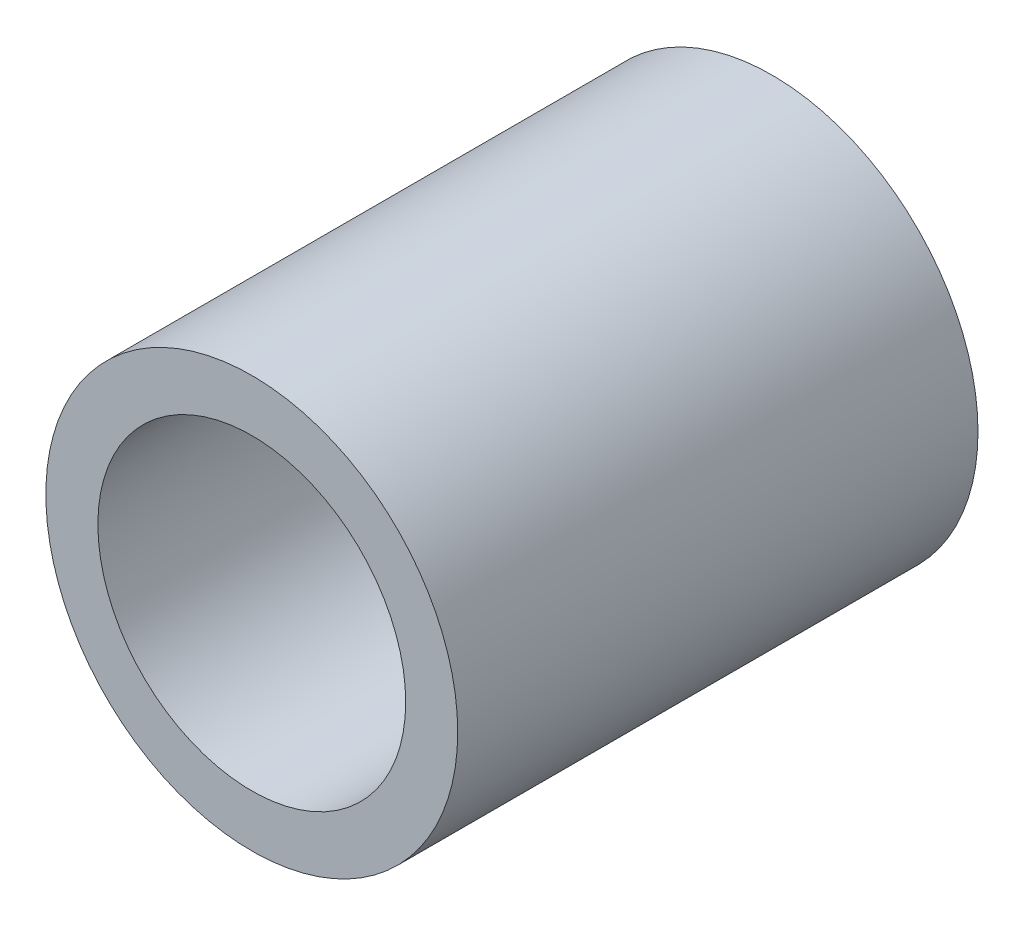
ISO-10303-21;
HEADER;
FILE_DESCRIPTION(('STEP AP214'),'2;1');
FILE_NAME('part.step','',(''),(''),'','','');
FILE_SCHEMA(('AUTOMOTIVE_DESIGN { 1 0 10303 214 1 1 1 1 }'));
ENDSEC;
DATA;
#1=APPLICATION_CONTEXT('core data for automotive mechanical design processes');
#2=APPLICATION_PROTOCOL_DEFINITION('international standard','automotive_design',2000,#1);
#3=PRODUCT_CONTEXT('',#1,'mechanical');
#4=PRODUCT('Part','Part','',(#3));
#5=PRODUCT_RELATED_PRODUCT_CATEGORY('part','',(#4));
#6=PRODUCT_DEFINITION_FORMATION('','',#4);
#7=PRODUCT_DEFINITION_CONTEXT('part definition',#1,'design');
#8=PRODUCT_DEFINITION('design','',#6,#7);
#9=PRODUCT_DEFINITION_SHAPE('','',#8);
#10=(LENGTH_UNIT() NAMED_UNIT(*) SI_UNIT(.MILLI.,.METRE.));
#11=(NAMED_UNIT(*) PLANE_ANGLE_UNIT() SI_UNIT($,.RADIAN.));
#12=(NAMED_UNIT(*) SI_UNIT($,.STERADIAN.) SOLID_ANGLE_UNIT());
#13=UNCERTAINTY_MEASURE_WITH_UNIT(LENGTH_MEASURE(1.E-05),#10,'distance_accuracy_value','');
#14=(GEOMETRIC_REPRESENTATION_CONTEXT(3) GLOBAL_UNCERTAINTY_ASSIGNED_CONTEXT((#13)) GLOBAL_UNIT_ASSIGNED_CONTEXT((#10,
#11,#12)) REPRESENTATION_CONTEXT('',''));
#15=CARTESIAN_POINT('',(0.,0.,0.));
#16=DIRECTION('',(0.,0.,1.));
#17=DIRECTION('',(1.,0.,0.));
#18=AXIS2_PLACEMENT_3D('',#15,#16,#17);
#19=CARTESIAN_POINT('',(0.,0.,-13.716));
#20=DIRECTION('',(0.,0.,1.));
#21=DIRECTION('',(1.,0.,0.));
#22=AXIS2_PLACEMENT_3D('',#19,#20,#21);
#23=CYLINDRICAL_SURFACE('',#22,8.1153);
#24=CARTESIAN_POINT('',(0.,0.,13.716));
#25=DIRECTION('',(0.,0.,1.));
#26=DIRECTION('',(1.,0.,0.));
#27=AXIS2_PLACEMENT_3D('',#24,#25,#26);
#28=CIRCLE('',#27,8.1153);
#29=CARTESIAN_POINT('',(8.1153,0.,13.716));
#30=VERTEX_POINT('',#29);
#31=EDGE_CURVE('E17',#30,#30,#28,.F.);
#32=ORIENTED_EDGE('',*,*,#31,.F.);
#33=EDGE_LOOP('',(#32));
#34=FACE_BOUND('',#33,.T.);
#35=CARTESIAN_POINT('',(0.,0.,-13.716));
#36=DIRECTION('',(0.,0.,1.));
#37=DIRECTION('',(1.,0.,0.));
#38=AXIS2_PLACEMENT_3D('',#35,#36,#37);
#39=CIRCLE('',#38,8.1153);
#40=CARTESIAN_POINT('',(8.1153,0.,-13.716));
#41=VERTEX_POINT('',#40);
#42=EDGE_CURVE('E26',#41,#41,#39,.F.);
#43=ORIENTED_EDGE('',*,*,#42,.T.);
#44=EDGE_LOOP('',(#43));
#45=FACE_BOUND('',#44,.T.);
#46=ADVANCED_FACE('F14',(#34,#45),#23,.F.);
#47=CARTESIAN_POINT('',(0.,0.,13.716));
#48=DIRECTION('',(0.,0.,1.));
#49=DIRECTION('',(1.,0.,0.));
#50=AXIS2_PLACEMENT_3D('',#47,#48,#49);
#51=PLANE('',#50);
#52=ORIENTED_EDGE('',*,*,#31,.T.);
#53=EDGE_LOOP('',(#52));
#54=FACE_BOUND('',#53,.T.);
#55=CARTESIAN_POINT('',(0.,0.,13.716));
#56=DIRECTION('',(0.,0.,1.));
#57=DIRECTION('',(1.,0.,0.));
#58=AXIS2_PLACEMENT_3D('',#55,#56,#57);
#59=CIRCLE('',#58,10.8585);
#60=CARTESIAN_POINT('',(10.8585,0.,13.716));
#61=VERTEX_POINT('',#60);
#62=EDGE_CURVE('E21',#61,#61,#59,.F.);
#63=ORIENTED_EDGE('',*,*,#62,.F.);
#64=EDGE_LOOP('',(#63));
#65=FACE_BOUND('',#64,.T.);
#66=ADVANCED_FACE('F34',(#54,#65),#51,.T.);
#67=CARTESIAN_POINT('',(0.,0.,-13.716));
#68=DIRECTION('',(0.,0.,1.));
#69=DIRECTION('',(1.,0.,0.));
#70=AXIS2_PLACEMENT_3D('',#67,#68,#69);
#71=PLANE('',#70);
#72=ORIENTED_EDGE('',*,*,#42,.F.);
#73=EDGE_LOOP('',(#72));
#74=FACE_BOUND('',#73,.T.);
#75=CARTESIAN_POINT('',(0.,0.,-13.716));
#76=DIRECTION('',(0.,0.,1.));
#77=DIRECTION('',(1.,0.,0.));
#78=AXIS2_PLACEMENT_3D('',#75,#76,#77);
#79=CIRCLE('',#78,10.8585);
#80=CARTESIAN_POINT('',(10.8585,0.,-13.716));
#81=VERTEX_POINT('',#80);
#82=EDGE_CURVE('E10',#81,#81,#79,.T.);
#83=ORIENTED_EDGE('',*,*,#82,.F.);
#84=EDGE_LOOP('',(#83));
#85=FACE_BOUND('',#84,.T.);
#86=ADVANCED_FACE('F42',(#74,#85),#71,.F.);
#87=CARTESIAN_POINT('',(0.,0.,-13.716));
#88=DIRECTION('',(0.,0.,1.));
#89=DIRECTION('',(1.,0.,0.));
#90=AXIS2_PLACEMENT_3D('',#87,#88,#89);
#91=CYLINDRICAL_SURFACE('',#90,10.8585);
#92=ORIENTED_EDGE('',*,*,#62,.T.);
#93=EDGE_LOOP('',(#92));
#94=FACE_BOUND('',#93,.T.);
#95=ORIENTED_EDGE('',*,*,#82,.T.);
#96=EDGE_LOOP('',(#95));
#97=FACE_BOUND('',#96,.T.);
#98=ADVANCED_FACE('F43',(#94,#97),#91,.T.);
#99=CLOSED_SHELL('',(#46,#66,#86,#98));
#100=MANIFOLD_SOLID_BREP('B1',#99);
#101=ADVANCED_BREP_SHAPE_REPRESENTATION('',(#18,#100),#14);
#102=SHAPE_DEFINITION_REPRESENTATION(#9,#101);
ENDSEC;
END-ISO-10303-21;
